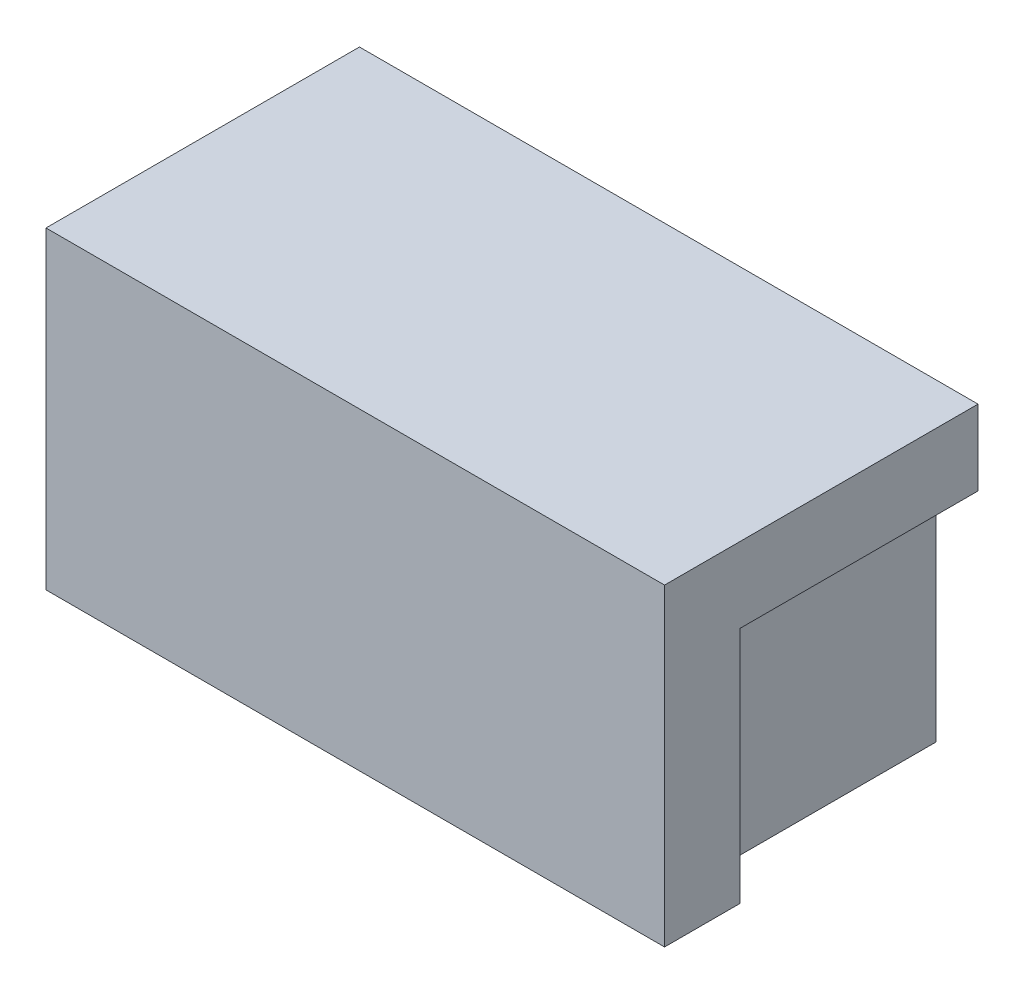
ISO-10303-21;
HEADER;
FILE_DESCRIPTION(('STEP AP214'),'2;1');
FILE_NAME('part.step','',(''),(''),'','','');
FILE_SCHEMA(('AUTOMOTIVE_DESIGN { 1 0 10303 214 1 1 1 1 }'));
ENDSEC;
DATA;
#1=APPLICATION_CONTEXT('core data for automotive mechanical design processes');
#2=APPLICATION_PROTOCOL_DEFINITION('international standard','automotive_design',2000,#1);
#3=PRODUCT_CONTEXT('',#1,'mechanical');
#4=PRODUCT('Part','Part','',(#3));
#5=PRODUCT_RELATED_PRODUCT_CATEGORY('part','',(#4));
#6=PRODUCT_DEFINITION_FORMATION('','',#4);
#7=PRODUCT_DEFINITION_CONTEXT('part definition',#1,'design');
#8=PRODUCT_DEFINITION('design','',#6,#7);
#9=PRODUCT_DEFINITION_SHAPE('','',#8);
#10=(LENGTH_UNIT() NAMED_UNIT(*) SI_UNIT(.MILLI.,.METRE.));
#11=(NAMED_UNIT(*) PLANE_ANGLE_UNIT() SI_UNIT($,.RADIAN.));
#12=(NAMED_UNIT(*) SI_UNIT($,.STERADIAN.) SOLID_ANGLE_UNIT());
#13=UNCERTAINTY_MEASURE_WITH_UNIT(LENGTH_MEASURE(1.E-05),#10,'distance_accuracy_value','');
#14=(GEOMETRIC_REPRESENTATION_CONTEXT(3) GLOBAL_UNCERTAINTY_ASSIGNED_CONTEXT((#13)) GLOBAL_UNIT_ASSIGNED_CONTEXT((#10,
#11,#12)) REPRESENTATION_CONTEXT('',''));
#15=CARTESIAN_POINT('',(0.,0.,0.));
#16=DIRECTION('',(0.,0.,1.));
#17=DIRECTION('',(1.,0.,0.));
#18=AXIS2_PLACEMENT_3D('',#15,#16,#17);
#19=CARTESIAN_POINT('',(24.,0.,0.));
#20=DIRECTION('',(1.,0.,0.));
#21=DIRECTION('',(0.,0.,-1.));
#22=AXIS2_PLACEMENT_3D('',#19,#20,#21);
#23=PLANE('',#22);
#24=DIRECTION('',(0.,1.,0.));
#25=VECTOR('',#24,1.);
#26=CARTESIAN_POINT('',(24.,0.,-7.5));
#27=LINE('',#26,#25);
#28=CARTESIAN_POINT('',(24.,-7.5,-7.5));
#29=VERTEX_POINT('',#28);
#30=CARTESIAN_POINT('',(24.,3.9,-7.5));
#31=VERTEX_POINT('',#30);
#32=EDGE_CURVE('E158',#29,#31,#27,.T.);
#33=ORIENTED_EDGE('',*,*,#32,.T.);
#34=DIRECTION('',(0.,0.,1.));
#35=VECTOR('',#34,1.);
#36=CARTESIAN_POINT('',(24.,3.9,0.));
#37=LINE('',#36,#35);
#38=CARTESIAN_POINT('',(24.,3.9,3.9));
#39=VERTEX_POINT('',#38);
#40=EDGE_CURVE('E148',#31,#39,#37,.T.);
#41=ORIENTED_EDGE('',*,*,#40,.T.);
#42=DIRECTION('',(0.,-1.,0.));
#43=VECTOR('',#42,1.);
#44=CARTESIAN_POINT('',(24.,0.,3.9));
#45=LINE('',#44,#43);
#46=CARTESIAN_POINT('',(24.,-7.5,3.9));
#47=VERTEX_POINT('',#46);
#48=EDGE_CURVE('E149',#39,#47,#45,.T.);
#49=ORIENTED_EDGE('',*,*,#48,.T.);
#50=DIRECTION('',(0.,0.,-1.));
#51=VECTOR('',#50,1.);
#52=CARTESIAN_POINT('',(24.,-7.5,0.));
#53=LINE('',#52,#51);
#54=EDGE_CURVE('E160',#47,#29,#53,.T.);
#55=ORIENTED_EDGE('',*,*,#54,.T.);
#56=EDGE_LOOP('',(#33,#41,#49,#55));
#57=FACE_BOUND('',#56,.T.);
#58=ADVANCED_FACE('F39',(#57),#23,.T.);
#59=CARTESIAN_POINT('',(0.,0.,0.));
#60=DIRECTION('',(1.,0.,0.));
#61=DIRECTION('',(0.,0.,-1.));
#62=AXIS2_PLACEMENT_3D('',#59,#60,#61);
#63=PLANE('',#62);
#64=CARTESIAN_POINT('',(0.,0.,0.));
#65=DIRECTION('',(1.,0.,0.));
#66=DIRECTION('',(0.,0.,-1.));
#67=AXIS2_PLACEMENT_3D('',#64,#65,#66);
#68=CIRCLE('',#67,1.8);
#69=CARTESIAN_POINT('',(0.,0.,-1.8));
#70=VERTEX_POINT('',#69);
#71=EDGE_CURVE('E192',#70,#70,#68,.T.);
#72=ORIENTED_EDGE('',*,*,#71,.F.);
#73=EDGE_LOOP('',(#72));
#74=FACE_BOUND('',#73,.T.);
#75=DIRECTION('',(0.,0.,-1.));
#76=VECTOR('',#75,1.);
#77=CARTESIAN_POINT('',(0.,3.9,0.));
#78=LINE('',#77,#76);
#79=CARTESIAN_POINT('',(0.,3.9,3.9));
#80=VERTEX_POINT('',#79);
#81=CARTESIAN_POINT('',(0.,3.9,-3.9));
#82=VERTEX_POINT('',#81);
#83=EDGE_CURVE('E64',#80,#82,#78,.T.);
#84=ORIENTED_EDGE('',*,*,#83,.F.);
#85=DIRECTION('',(0.,-1.,0.));
#86=VECTOR('',#85,1.);
#87=CARTESIAN_POINT('',(0.,0.,3.9));
#88=LINE('',#87,#86);
#89=CARTESIAN_POINT('',(0.,-7.5,3.9));
#90=VERTEX_POINT('',#89);
#91=EDGE_CURVE('E162',#80,#90,#88,.T.);
#92=ORIENTED_EDGE('',*,*,#91,.T.);
#93=DIRECTION('',(0.,0.,-1.));
#94=VECTOR('',#93,1.);
#95=CARTESIAN_POINT('',(0.,-7.5,0.));
#96=LINE('',#95,#94);
#97=CARTESIAN_POINT('',(0.,-7.5,-3.9));
#98=VERTEX_POINT('',#97);
#99=EDGE_CURVE('E188',#90,#98,#96,.T.);
#100=ORIENTED_EDGE('',*,*,#99,.T.);
#101=DIRECTION('',(0.,1.,0.));
#102=VECTOR('',#101,1.);
#103=CARTESIAN_POINT('',(0.,0.,-3.9));
#104=LINE('',#103,#102);
#105=EDGE_CURVE('E169',#98,#82,#104,.T.);
#106=ORIENTED_EDGE('',*,*,#105,.T.);
#107=EDGE_LOOP('',(#84,#92,#100,#106));
#108=FACE_BOUND('',#107,.T.);
#109=ADVANCED_FACE('F242',(#74,#108),#63,.T.);
#110=CARTESIAN_POINT('',(-3.6,7.5,0.));
#111=DIRECTION('',(0.,-1.,0.));
#112=DIRECTION('',(0.,0.,-1.));
#113=AXIS2_PLACEMENT_3D('',#110,#111,#112);
#114=PLANE('',#113);
#115=DIRECTION('',(0.,0.,1.));
#116=VECTOR('',#115,1.);
#117=CARTESIAN_POINT('',(26.,7.5,0.));
#118=LINE('',#117,#116);
#119=CARTESIAN_POINT('',(26.,7.5,-7.5));
#120=VERTEX_POINT('',#119);
#121=CARTESIAN_POINT('',(26.,7.5,7.5));
#122=VERTEX_POINT('',#121);
#123=EDGE_CURVE('E136',#120,#122,#118,.T.);
#124=ORIENTED_EDGE('',*,*,#123,.F.);
#125=DIRECTION('',(1.,0.,0.));
#126=VECTOR('',#125,1.);
#127=CARTESIAN_POINT('',(-3.6,7.5,-7.5));
#128=LINE('',#127,#126);
#129=CARTESIAN_POINT('',(-3.6,7.5,-7.5));
#130=VERTEX_POINT('',#129);
#131=EDGE_CURVE('E11',#130,#120,#128,.T.);
#132=ORIENTED_EDGE('',*,*,#131,.F.);
#133=DIRECTION('',(0.,0.,-1.));
#134=VECTOR('',#133,1.);
#135=CARTESIAN_POINT('',(-3.6,7.5,0.));
#136=LINE('',#135,#134);
#137=CARTESIAN_POINT('',(-3.6,7.5,7.5));
#138=VERTEX_POINT('',#137);
#139=EDGE_CURVE('E189',#138,#130,#136,.T.);
#140=ORIENTED_EDGE('',*,*,#139,.F.);
#141=DIRECTION('',(1.,0.,0.));
#142=VECTOR('',#141,1.);
#143=CARTESIAN_POINT('',(-3.6,7.5,7.5));
#144=LINE('',#143,#142);
#145=EDGE_CURVE('E43',#138,#122,#144,.T.);
#146=ORIENTED_EDGE('',*,*,#145,.T.);
#147=EDGE_LOOP('',(#124,#132,#140,#146));
#148=FACE_BOUND('',#147,.T.);
#149=ADVANCED_FACE('F41',(#148),#114,.F.);
#150=CARTESIAN_POINT('',(-3.6,0.,-7.5));
#151=DIRECTION('',(0.,0.,-1.));
#152=DIRECTION('',(-1.,0.,0.));
#153=AXIS2_PLACEMENT_3D('',#150,#151,#152);
#154=PLANE('',#153);
#155=DIRECTION('',(-1.,0.,0.));
#156=VECTOR('',#155,1.);
#157=CARTESIAN_POINT('',(26.,3.9,-7.5));
#158=LINE('',#157,#156);
#159=CARTESIAN_POINT('',(26.,3.9,-7.5));
#160=VERTEX_POINT('',#159);
#161=EDGE_CURVE('E129',#160,#31,#158,.T.);
#162=ORIENTED_EDGE('',*,*,#161,.T.);
#163=ORIENTED_EDGE('',*,*,#32,.F.);
#164=DIRECTION('',(1.,0.,0.));
#165=VECTOR('',#164,1.);
#166=CARTESIAN_POINT('',(-3.6,-7.5,-7.5));
#167=LINE('',#166,#165);
#168=CARTESIAN_POINT('',(-3.6,-7.5,-7.5));
#169=VERTEX_POINT('',#168);
#170=EDGE_CURVE('E48',#169,#29,#167,.T.);
#171=ORIENTED_EDGE('',*,*,#170,.F.);
#172=DIRECTION('',(0.,1.,0.));
#173=VECTOR('',#172,1.);
#174=CARTESIAN_POINT('',(-3.6,0.,-7.5));
#175=LINE('',#174,#173);
#176=EDGE_CURVE('E197',#169,#130,#175,.T.);
#177=ORIENTED_EDGE('',*,*,#176,.T.);
#178=ORIENTED_EDGE('',*,*,#131,.T.);
#179=DIRECTION('',(0.,1.,0.));
#180=VECTOR('',#179,1.);
#181=CARTESIAN_POINT('',(26.,0.,-7.5));
#182=LINE('',#181,#180);
#183=EDGE_CURVE('E124',#160,#120,#182,.T.);
#184=ORIENTED_EDGE('',*,*,#183,.F.);
#185=EDGE_LOOP('',(#162,#163,#171,#177,#178,#184));
#186=FACE_BOUND('',#185,.T.);
#187=ADVANCED_FACE('F126',(#186),#154,.T.);
#188=CARTESIAN_POINT('',(-3.6,-7.5,0.));
#189=DIRECTION('',(0.,-1.,0.));
#190=DIRECTION('',(0.,0.,-1.));
#191=AXIS2_PLACEMENT_3D('',#188,#189,#190);
#192=PLANE('',#191);
#193=DIRECTION('',(-1.,0.,0.));
#194=VECTOR('',#193,1.);
#195=CARTESIAN_POINT('',(22.,-7.5,3.9));
#196=LINE('',#195,#194);
#197=CARTESIAN_POINT('',(22.,-7.5,3.9));
#198=VERTEX_POINT('',#197);
#199=EDGE_CURVE('E174',#198,#90,#196,.T.);
#200=ORIENTED_EDGE('',*,*,#199,.F.);
#201=DIRECTION('',(0.,0.,-1.));
#202=VECTOR('',#201,1.);
#203=CARTESIAN_POINT('',(22.,-7.5,0.));
#204=LINE('',#203,#202);
#205=CARTESIAN_POINT('',(22.,-7.5,-3.9));
#206=VERTEX_POINT('',#205);
#207=EDGE_CURVE('E157',#198,#206,#204,.T.);
#208=ORIENTED_EDGE('',*,*,#207,.T.);
#209=DIRECTION('',(-1.,0.,0.));
#210=VECTOR('',#209,1.);
#211=CARTESIAN_POINT('',(22.,-7.5,-3.9));
#212=LINE('',#211,#210);
#213=EDGE_CURVE('E180',#206,#98,#212,.T.);
#214=ORIENTED_EDGE('',*,*,#213,.T.);
#215=ORIENTED_EDGE('',*,*,#99,.F.);
#216=EDGE_LOOP('',(#200,#208,#214,#215));
#217=FACE_BOUND('',#216,.T.);
#218=ORIENTED_EDGE('',*,*,#54,.F.);
#219=DIRECTION('',(-1.,0.,0.));
#220=VECTOR('',#219,1.);
#221=CARTESIAN_POINT('',(26.,-7.5,3.9));
#222=LINE('',#221,#220);
#223=CARTESIAN_POINT('',(26.,-7.5,3.9));
#224=VERTEX_POINT('',#223);
#225=EDGE_CURVE('E56',#224,#47,#222,.T.);
#226=ORIENTED_EDGE('',*,*,#225,.F.);
#227=DIRECTION('',(0.,0.,-1.));
#228=VECTOR('',#227,1.);
#229=CARTESIAN_POINT('',(26.,-7.5,0.));
#230=LINE('',#229,#228);
#231=CARTESIAN_POINT('',(26.,-7.5,7.5));
#232=VERTEX_POINT('',#231);
#233=EDGE_CURVE('E218',#232,#224,#230,.T.);
#234=ORIENTED_EDGE('',*,*,#233,.F.);
#235=DIRECTION('',(1.,0.,0.));
#236=VECTOR('',#235,1.);
#237=CARTESIAN_POINT('',(-3.6,-7.5,7.5));
#238=LINE('',#237,#236);
#239=CARTESIAN_POINT('',(-3.6,-7.5,7.5));
#240=VERTEX_POINT('',#239);
#241=EDGE_CURVE('E206',#240,#232,#238,.T.);
#242=ORIENTED_EDGE('',*,*,#241,.F.);
#243=DIRECTION('',(0.,0.,-1.));
#244=VECTOR('',#243,1.);
#245=CARTESIAN_POINT('',(-3.6,-7.5,0.));
#246=LINE('',#245,#244);
#247=EDGE_CURVE('E194',#240,#169,#246,.T.);
#248=ORIENTED_EDGE('',*,*,#247,.T.);
#249=ORIENTED_EDGE('',*,*,#170,.T.);
#250=EDGE_LOOP('',(#218,#226,#234,#242,#248,#249));
#251=FACE_BOUND('',#250,.T.);
#252=ADVANCED_FACE('F227',(#217,#251),#192,.T.);
#253=CARTESIAN_POINT('',(-3.6,0.,7.5));
#254=DIRECTION('',(0.,0.,-1.));
#255=DIRECTION('',(-1.,0.,0.));
#256=AXIS2_PLACEMENT_3D('',#253,#254,#255);
#257=PLANE('',#256);
#258=DIRECTION('',(0.,-1.,0.));
#259=VECTOR('',#258,1.);
#260=CARTESIAN_POINT('',(26.,0.,7.5));
#261=LINE('',#260,#259);
#262=EDGE_CURVE('E214',#122,#232,#261,.T.);
#263=ORIENTED_EDGE('',*,*,#262,.F.);
#264=ORIENTED_EDGE('',*,*,#145,.F.);
#265=DIRECTION('',(0.,1.,0.));
#266=VECTOR('',#265,1.);
#267=CARTESIAN_POINT('',(-3.6,0.,7.5));
#268=LINE('',#267,#266);
#269=EDGE_CURVE('E191',#240,#138,#268,.T.);
#270=ORIENTED_EDGE('',*,*,#269,.F.);
#271=ORIENTED_EDGE('',*,*,#241,.T.);
#272=EDGE_LOOP('',(#263,#264,#270,#271));
#273=FACE_BOUND('',#272,.T.);
#274=ADVANCED_FACE('F217',(#273),#257,.F.);
#275=CARTESIAN_POINT('',(-3.6,0.,0.));
#276=DIRECTION('',(1.,0.,0.));
#277=DIRECTION('',(0.,0.,-1.));
#278=AXIS2_PLACEMENT_3D('',#275,#276,#277);
#279=CYLINDRICAL_SURFACE('',#278,1.8);
#280=CARTESIAN_POINT('',(-3.6,0.,0.));
#281=DIRECTION('',(1.,0.,0.));
#282=DIRECTION('',(0.,0.,-1.));
#283=AXIS2_PLACEMENT_3D('',#280,#281,#282);
#284=CIRCLE('',#283,1.8);
#285=CARTESIAN_POINT('',(-3.6,0.,-1.8));
#286=VERTEX_POINT('',#285);
#287=EDGE_CURVE('E199',#286,#286,#284,.T.);
#288=ORIENTED_EDGE('',*,*,#287,.F.);
#289=EDGE_LOOP('',(#288));
#290=FACE_BOUND('',#289,.T.);
#291=ORIENTED_EDGE('',*,*,#71,.T.);
#292=EDGE_LOOP('',(#291));
#293=FACE_BOUND('',#292,.T.);
#294=ADVANCED_FACE('F233',(#290,#293),#279,.F.);
#295=CARTESIAN_POINT('',(-3.6,0.,0.));
#296=DIRECTION('',(1.,0.,0.));
#297=DIRECTION('',(0.,0.,-1.));
#298=AXIS2_PLACEMENT_3D('',#295,#296,#297);
#299=PLANE('',#298);
#300=ORIENTED_EDGE('',*,*,#139,.T.);
#301=ORIENTED_EDGE('',*,*,#176,.F.);
#302=ORIENTED_EDGE('',*,*,#247,.F.);
#303=ORIENTED_EDGE('',*,*,#269,.T.);
#304=EDGE_LOOP('',(#300,#301,#302,#303));
#305=FACE_BOUND('',#304,.T.);
#306=ORIENTED_EDGE('',*,*,#287,.T.);
#307=EDGE_LOOP('',(#306));
#308=FACE_BOUND('',#307,.T.);
#309=ADVANCED_FACE('F229',(#305,#308),#299,.F.);
#310=CARTESIAN_POINT('',(22.,0.,3.9));
#311=DIRECTION('',(0.,0.,-1.));
#312=DIRECTION('',(0.,1.,0.));
#313=AXIS2_PLACEMENT_3D('',#310,#311,#312);
#314=PLANE('',#313);
#315=ORIENTED_EDGE('',*,*,#91,.F.);
#316=DIRECTION('',(-1.,0.,0.));
#317=VECTOR('',#316,1.);
#318=CARTESIAN_POINT('',(22.,3.9,3.9));
#319=LINE('',#318,#317);
#320=CARTESIAN_POINT('',(22.,3.9,3.9));
#321=VERTEX_POINT('',#320);
#322=EDGE_CURVE('E186',#321,#80,#319,.T.);
#323=ORIENTED_EDGE('',*,*,#322,.F.);
#324=DIRECTION('',(0.,-1.,0.));
#325=VECTOR('',#324,1.);
#326=CARTESIAN_POINT('',(22.,0.,3.9));
#327=LINE('',#326,#325);
#328=EDGE_CURVE('E165',#321,#198,#327,.T.);
#329=ORIENTED_EDGE('',*,*,#328,.T.);
#330=ORIENTED_EDGE('',*,*,#199,.T.);
#331=EDGE_LOOP('',(#315,#323,#329,#330));
#332=FACE_BOUND('',#331,.T.);
#333=ADVANCED_FACE('F232',(#332),#314,.T.);
#334=CARTESIAN_POINT('',(22.,3.9,0.));
#335=DIRECTION('',(0.,1.,0.));
#336=DIRECTION('',(0.,0.,1.));
#337=AXIS2_PLACEMENT_3D('',#334,#335,#336);
#338=PLANE('',#337);
#339=ORIENTED_EDGE('',*,*,#83,.T.);
#340=DIRECTION('',(-1.,0.,0.));
#341=VECTOR('',#340,1.);
#342=CARTESIAN_POINT('',(22.,3.9,-3.9));
#343=LINE('',#342,#341);
#344=CARTESIAN_POINT('',(22.,3.9,-3.9));
#345=VERTEX_POINT('',#344);
#346=EDGE_CURVE('E183',#345,#82,#343,.T.);
#347=ORIENTED_EDGE('',*,*,#346,.F.);
#348=DIRECTION('',(0.,0.,-1.));
#349=VECTOR('',#348,1.);
#350=CARTESIAN_POINT('',(22.,3.9,0.));
#351=LINE('',#350,#349);
#352=EDGE_CURVE('E168',#321,#345,#351,.T.);
#353=ORIENTED_EDGE('',*,*,#352,.F.);
#354=ORIENTED_EDGE('',*,*,#322,.T.);
#355=EDGE_LOOP('',(#339,#347,#353,#354));
#356=FACE_BOUND('',#355,.T.);
#357=ADVANCED_FACE('F276',(#356),#338,.F.);
#358=CARTESIAN_POINT('',(22.,0.,-3.9));
#359=DIRECTION('',(0.,0.,1.));
#360=DIRECTION('',(1.,0.,0.));
#361=AXIS2_PLACEMENT_3D('',#358,#359,#360);
#362=PLANE('',#361);
#363=ORIENTED_EDGE('',*,*,#105,.F.);
#364=ORIENTED_EDGE('',*,*,#213,.F.);
#365=DIRECTION('',(0.,1.,0.));
#366=VECTOR('',#365,1.);
#367=CARTESIAN_POINT('',(22.,0.,-3.9));
#368=LINE('',#367,#366);
#369=EDGE_CURVE('E171',#206,#345,#368,.T.);
#370=ORIENTED_EDGE('',*,*,#369,.T.);
#371=ORIENTED_EDGE('',*,*,#346,.T.);
#372=EDGE_LOOP('',(#363,#364,#370,#371));
#373=FACE_BOUND('',#372,.T.);
#374=ADVANCED_FACE('F283',(#373),#362,.T.);
#375=CARTESIAN_POINT('',(22.,0.,0.));
#376=DIRECTION('',(1.,0.,0.));
#377=DIRECTION('',(0.,0.,-1.));
#378=AXIS2_PLACEMENT_3D('',#375,#376,#377);
#379=PLANE('',#378);
#380=ORIENTED_EDGE('',*,*,#328,.F.);
#381=ORIENTED_EDGE('',*,*,#352,.T.);
#382=ORIENTED_EDGE('',*,*,#369,.F.);
#383=ORIENTED_EDGE('',*,*,#207,.F.);
#384=EDGE_LOOP('',(#380,#381,#382,#383));
#385=FACE_BOUND('',#384,.T.);
#386=ADVANCED_FACE('F291',(#385),#379,.F.);
#387=CARTESIAN_POINT('',(26.,3.9,0.));
#388=DIRECTION('',(0.,1.,0.));
#389=DIRECTION('',(0.,0.,1.));
#390=AXIS2_PLACEMENT_3D('',#387,#388,#389);
#391=PLANE('',#390);
#392=ORIENTED_EDGE('',*,*,#40,.F.);
#393=ORIENTED_EDGE('',*,*,#161,.F.);
#394=DIRECTION('',(0.,0.,-1.));
#395=VECTOR('',#394,1.);
#396=CARTESIAN_POINT('',(26.,3.9,0.));
#397=LINE('',#396,#395);
#398=CARTESIAN_POINT('',(26.,3.9,3.9));
#399=VERTEX_POINT('',#398);
#400=EDGE_CURVE('E137',#399,#160,#397,.T.);
#401=ORIENTED_EDGE('',*,*,#400,.F.);
#402=DIRECTION('',(-1.,0.,0.));
#403=VECTOR('',#402,1.);
#404=CARTESIAN_POINT('',(26.,3.9,3.9));
#405=LINE('',#404,#403);
#406=EDGE_CURVE('E152',#399,#39,#405,.T.);
#407=ORIENTED_EDGE('',*,*,#406,.T.);
#408=EDGE_LOOP('',(#392,#393,#401,#407));
#409=FACE_BOUND('',#408,.T.);
#410=ADVANCED_FACE('F146',(#409),#391,.F.);
#411=CARTESIAN_POINT('',(26.,0.,3.9));
#412=DIRECTION('',(0.,0.,1.));
#413=DIRECTION('',(0.,-1.,0.));
#414=AXIS2_PLACEMENT_3D('',#411,#412,#413);
#415=PLANE('',#414);
#416=ORIENTED_EDGE('',*,*,#48,.F.);
#417=ORIENTED_EDGE('',*,*,#406,.F.);
#418=DIRECTION('',(0.,1.,0.));
#419=VECTOR('',#418,1.);
#420=CARTESIAN_POINT('',(26.,0.,3.9));
#421=LINE('',#420,#419);
#422=EDGE_CURVE('E141',#224,#399,#421,.T.);
#423=ORIENTED_EDGE('',*,*,#422,.F.);
#424=ORIENTED_EDGE('',*,*,#225,.T.);
#425=EDGE_LOOP('',(#416,#417,#423,#424));
#426=FACE_BOUND('',#425,.T.);
#427=ADVANCED_FACE('F306',(#426),#415,.F.);
#428=CARTESIAN_POINT('',(26.,0.,0.));
#429=DIRECTION('',(1.,0.,0.));
#430=DIRECTION('',(0.,0.,-1.));
#431=AXIS2_PLACEMENT_3D('',#428,#429,#430);
#432=PLANE('',#431);
#433=ORIENTED_EDGE('',*,*,#400,.T.);
#434=ORIENTED_EDGE('',*,*,#183,.T.);
#435=ORIENTED_EDGE('',*,*,#123,.T.);
#436=ORIENTED_EDGE('',*,*,#262,.T.);
#437=ORIENTED_EDGE('',*,*,#233,.T.);
#438=ORIENTED_EDGE('',*,*,#422,.T.);
#439=EDGE_LOOP('',(#433,#434,#435,#436,#437,#438));
#440=FACE_BOUND('',#439,.T.);
#441=ADVANCED_FACE('F140',(#440),#432,.T.);
#442=CLOSED_SHELL('',(#58,#109,#149,#187,#252,#274,#294,#309,#333,#357,#374,#386,#410,#427,#441));
#443=MANIFOLD_SOLID_BREP('B2',#442);
#444=ADVANCED_BREP_SHAPE_REPRESENTATION('',(#18,#443),#14);
#445=SHAPE_DEFINITION_REPRESENTATION(#9,#444);
ENDSEC;
END-ISO-10303-21;
